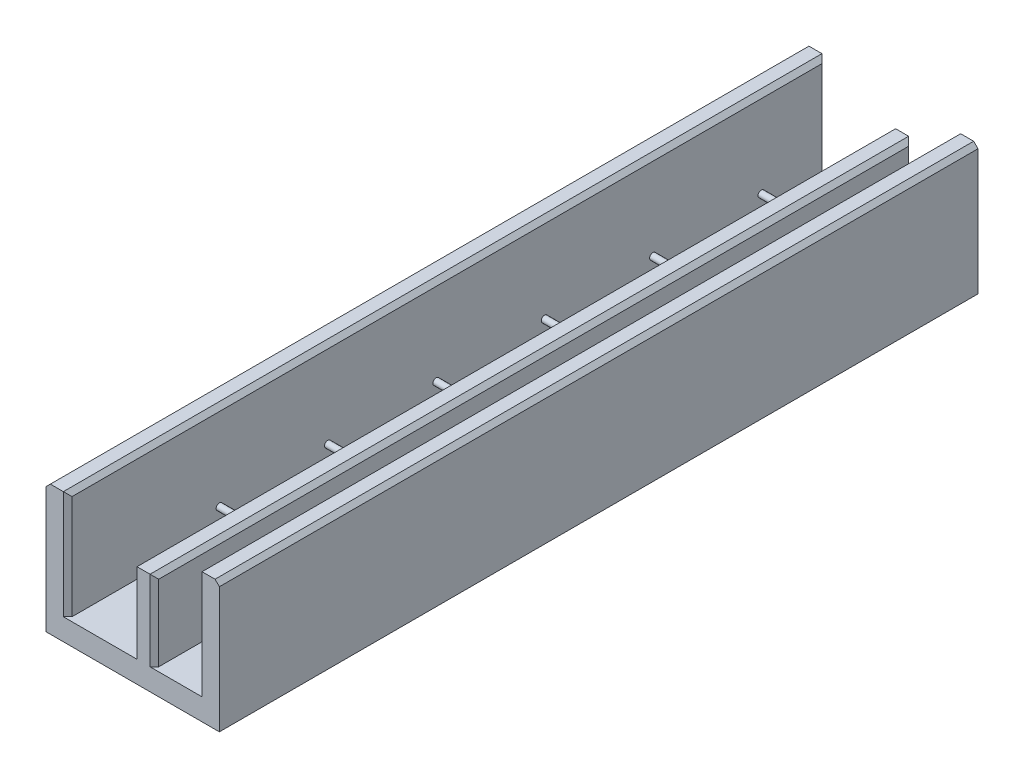
ISO-10303-21;
HEADER;
FILE_DESCRIPTION(('STEP AP214'),'2;1');
FILE_NAME('part.step','',(''),(''),'','','');
FILE_SCHEMA(('AUTOMOTIVE_DESIGN { 1 0 10303 214 1 1 1 1 }'));
ENDSEC;
DATA;
#1=APPLICATION_CONTEXT('core data for automotive mechanical design processes');
#2=APPLICATION_PROTOCOL_DEFINITION('international standard','automotive_design',2000,#1);
#3=PRODUCT_CONTEXT('',#1,'mechanical');
#4=PRODUCT('Part','Part','',(#3));
#5=PRODUCT_RELATED_PRODUCT_CATEGORY('part','',(#4));
#6=PRODUCT_DEFINITION_FORMATION('','',#4);
#7=PRODUCT_DEFINITION_CONTEXT('part definition',#1,'design');
#8=PRODUCT_DEFINITION('design','',#6,#7);
#9=PRODUCT_DEFINITION_SHAPE('','',#8);
#10=(LENGTH_UNIT() NAMED_UNIT(*) SI_UNIT(.MILLI.,.METRE.));
#11=(NAMED_UNIT(*) PLANE_ANGLE_UNIT() SI_UNIT($,.RADIAN.));
#12=(NAMED_UNIT(*) SI_UNIT($,.STERADIAN.) SOLID_ANGLE_UNIT());
#13=UNCERTAINTY_MEASURE_WITH_UNIT(LENGTH_MEASURE(1.E-05),#10,'distance_accuracy_value','');
#14=(GEOMETRIC_REPRESENTATION_CONTEXT(3) GLOBAL_UNCERTAINTY_ASSIGNED_CONTEXT((#13)) GLOBAL_UNIT_ASSIGNED_CONTEXT((#10,
#11,#12)) REPRESENTATION_CONTEXT('',''));
#15=CARTESIAN_POINT('',(0.,0.,0.));
#16=DIRECTION('',(0.,0.,1.));
#17=DIRECTION('',(1.,0.,0.));
#18=AXIS2_PLACEMENT_3D('',#15,#16,#17);
#19=CARTESIAN_POINT('',(0.,600.,3500.));
#20=DIRECTION('',(-1.,0.,0.));
#21=DIRECTION('',(0.,0.,1.));
#22=AXIS2_PLACEMENT_3D('',#19,#20,#21);
#23=PLANE('',#22);
#24=DIRECTION('',(0.,1.,0.));
#25=VECTOR('',#24,1.);
#26=CARTESIAN_POINT('',(0.,600.,0.));
#27=LINE('',#26,#25);
#28=CARTESIAN_POINT('',(0.,0.,0.));
#29=VERTEX_POINT('',#28);
#30=CARTESIAN_POINT('',(0.,580.,0.));
#31=VERTEX_POINT('',#30);
#32=EDGE_CURVE('E219',#29,#31,#27,.T.);
#33=ORIENTED_EDGE('',*,*,#32,.T.);
#34=DIRECTION('',(0.,0.,1.));
#35=VECTOR('',#34,1.);
#36=CARTESIAN_POINT('',(0.,580.,3500.));
#37=LINE('',#36,#35);
#38=CARTESIAN_POINT('',(0.,580.,3500.));
#39=VERTEX_POINT('',#38);
#40=EDGE_CURVE('E289',#31,#39,#37,.T.);
#41=ORIENTED_EDGE('',*,*,#40,.T.);
#42=DIRECTION('',(0.,1.,0.));
#43=VECTOR('',#42,1.);
#44=CARTESIAN_POINT('',(0.,600.,3500.));
#45=LINE('',#44,#43);
#46=CARTESIAN_POINT('',(0.,0.,3500.));
#47=VERTEX_POINT('',#46);
#48=EDGE_CURVE('E238',#47,#39,#45,.T.);
#49=ORIENTED_EDGE('',*,*,#48,.F.);
#50=DIRECTION('',(0.,0.,-1.));
#51=VECTOR('',#50,1.);
#52=CARTESIAN_POINT('',(0.,0.,3500.));
#53=LINE('',#52,#51);
#54=EDGE_CURVE('E210',#47,#29,#53,.T.);
#55=ORIENTED_EDGE('',*,*,#54,.T.);
#56=EDGE_LOOP('',(#33,#41,#49,#55));
#57=FACE_BOUND('',#56,.T.);
#58=ADVANCED_FACE('F37',(#57),#23,.F.);
#59=CARTESIAN_POINT('',(-100.,600.,3500.));
#60=DIRECTION('',(0.,-1.,0.));
#61=DIRECTION('',(0.,0.,-1.));
#62=AXIS2_PLACEMENT_3D('',#59,#60,#61);
#63=PLANE('',#62);
#64=DIRECTION('',(-1.,0.,0.));
#65=VECTOR('',#64,1.);
#66=CARTESIAN_POINT('',(-100.,600.,3500.));
#67=LINE('',#66,#65);
#68=CARTESIAN_POINT('',(-20.,600.,3500.));
#69=VERTEX_POINT('',#68);
#70=CARTESIAN_POINT('',(-80.0000000000002,600.,3500.));
#71=VERTEX_POINT('',#70);
#72=EDGE_CURVE('E369',#69,#71,#67,.T.);
#73=ORIENTED_EDGE('',*,*,#72,.F.);
#74=DIRECTION('',(0.,0.,-1.));
#75=VECTOR('',#74,1.);
#76=CARTESIAN_POINT('',(-20.,600.,3500.));
#77=LINE('',#76,#75);
#78=CARTESIAN_POINT('',(-20.,600.,0.));
#79=VERTEX_POINT('',#78);
#80=EDGE_CURVE('E286',#69,#79,#77,.T.);
#81=ORIENTED_EDGE('',*,*,#80,.T.);
#82=DIRECTION('',(-1.,0.,0.));
#83=VECTOR('',#82,1.);
#84=CARTESIAN_POINT('',(-100.,600.,0.));
#85=LINE('',#84,#83);
#86=CARTESIAN_POINT('',(-80.0000000000002,600.,0.));
#87=VERTEX_POINT('',#86);
#88=EDGE_CURVE('E222',#79,#87,#85,.T.);
#89=ORIENTED_EDGE('',*,*,#88,.T.);
#90=DIRECTION('',(0.,0.,1.));
#91=VECTOR('',#90,1.);
#92=CARTESIAN_POINT('',(-80.0000000000002,600.,3500.));
#93=LINE('',#92,#91);
#94=EDGE_CURVE('E284',#87,#71,#93,.T.);
#95=ORIENTED_EDGE('',*,*,#94,.T.);
#96=EDGE_LOOP('',(#73,#81,#89,#95));
#97=FACE_BOUND('',#96,.T.);
#98=ADVANCED_FACE('F398',(#97),#63,.F.);
#99=CARTESIAN_POINT('',(-100.,99.9999999999998,3500.));
#100=DIRECTION('',(1.,0.,0.));
#101=DIRECTION('',(0.,0.,-1.));
#102=AXIS2_PLACEMENT_3D('',#99,#100,#101);
#103=PLANE('',#102);
#104=CARTESIAN_POINT('',(-100.,200.,2800.));
#105=DIRECTION('',(1.,0.,0.));
#106=DIRECTION('',(0.,0.,-1.));
#107=AXIS2_PLACEMENT_3D('',#104,#105,#106);
#108=CIRCLE('',#107,15.);
#109=CARTESIAN_POINT('',(-100.,200.,2785.));
#110=VERTEX_POINT('',#109);
#111=EDGE_CURVE('E925',#110,#110,#108,.F.);
#112=ORIENTED_EDGE('',*,*,#111,.F.);
#113=EDGE_LOOP('',(#112));
#114=FACE_BOUND('',#113,.T.);
#115=CARTESIAN_POINT('',(-100.,200.,2300.));
#116=DIRECTION('',(1.,0.,0.));
#117=DIRECTION('',(0.,0.,-1.));
#118=AXIS2_PLACEMENT_3D('',#115,#116,#117);
#119=CIRCLE('',#118,15.);
#120=CARTESIAN_POINT('',(-100.,200.,2285.));
#121=VERTEX_POINT('',#120);
#122=EDGE_CURVE('E916',#121,#121,#119,.F.);
#123=ORIENTED_EDGE('',*,*,#122,.F.);
#124=EDGE_LOOP('',(#123));
#125=FACE_BOUND('',#124,.T.);
#126=CARTESIAN_POINT('',(-100.,200.,1800.));
#127=DIRECTION('',(1.,0.,0.));
#128=DIRECTION('',(0.,0.,-1.));
#129=AXIS2_PLACEMENT_3D('',#126,#127,#128);
#130=CIRCLE('',#129,15.);
#131=CARTESIAN_POINT('',(-100.,200.,1785.));
#132=VERTEX_POINT('',#131);
#133=EDGE_CURVE('E906',#132,#132,#130,.F.);
#134=ORIENTED_EDGE('',*,*,#133,.F.);
#135=EDGE_LOOP('',(#134));
#136=FACE_BOUND('',#135,.T.);
#137=CARTESIAN_POINT('',(-100.,200.,1300.));
#138=DIRECTION('',(1.,0.,0.));
#139=DIRECTION('',(0.,0.,-1.));
#140=AXIS2_PLACEMENT_3D('',#137,#138,#139);
#141=CIRCLE('',#140,15.);
#142=CARTESIAN_POINT('',(-100.,200.,1285.));
#143=VERTEX_POINT('',#142);
#144=EDGE_CURVE('E896',#143,#143,#141,.F.);
#145=ORIENTED_EDGE('',*,*,#144,.F.);
#146=EDGE_LOOP('',(#145));
#147=FACE_BOUND('',#146,.T.);
#148=CARTESIAN_POINT('',(-100.,200.,800.));
#149=DIRECTION('',(1.,0.,0.));
#150=DIRECTION('',(0.,0.,-1.));
#151=AXIS2_PLACEMENT_3D('',#148,#149,#150);
#152=CIRCLE('',#151,15.);
#153=CARTESIAN_POINT('',(-100.,200.,785.));
#154=VERTEX_POINT('',#153);
#155=EDGE_CURVE('E885',#154,#154,#152,.F.);
#156=ORIENTED_EDGE('',*,*,#155,.F.);
#157=EDGE_LOOP('',(#156));
#158=FACE_BOUND('',#157,.T.);
#159=CARTESIAN_POINT('',(-100.,200.,300.));
#160=DIRECTION('',(1.,0.,0.));
#161=DIRECTION('',(0.,0.,-1.));
#162=AXIS2_PLACEMENT_3D('',#159,#160,#161);
#163=CIRCLE('',#162,15.);
#164=CARTESIAN_POINT('',(-100.,200.,285.));
#165=VERTEX_POINT('',#164);
#166=EDGE_CURVE('E556',#165,#165,#163,.F.);
#167=ORIENTED_EDGE('',*,*,#166,.F.);
#168=EDGE_LOOP('',(#167));
#169=FACE_BOUND('',#168,.T.);
#170=DIRECTION('',(0.,0.,-1.));
#171=VECTOR('',#170,1.);
#172=CARTESIAN_POINT('',(-100.,580.,3500.));
#173=LINE('',#172,#171);
#174=CARTESIAN_POINT('',(-100.,580.,3480.));
#175=VERTEX_POINT('',#174);
#176=CARTESIAN_POINT('',(-100.,580.,20.));
#177=VERTEX_POINT('',#176);
#178=EDGE_CURVE('E300',#175,#177,#173,.T.);
#179=ORIENTED_EDGE('',*,*,#178,.T.);
#180=DIRECTION('',(0.,-1.,0.));
#181=VECTOR('',#180,1.);
#182=CARTESIAN_POINT('',(-100.,99.9999999999998,20.));
#183=LINE('',#182,#181);
#184=CARTESIAN_POINT('',(-100.,99.9999999999998,20.));
#185=VERTEX_POINT('',#184);
#186=EDGE_CURVE('E302',#177,#185,#183,.T.);
#187=ORIENTED_EDGE('',*,*,#186,.T.);
#188=DIRECTION('',(0.,0.,-1.));
#189=VECTOR('',#188,1.);
#190=CARTESIAN_POINT('',(-100.,99.9999999999998,3500.));
#191=LINE('',#190,#189);
#192=CARTESIAN_POINT('',(-100.,99.9999999999998,3480.));
#193=VERTEX_POINT('',#192);
#194=EDGE_CURVE('E248',#193,#185,#191,.T.);
#195=ORIENTED_EDGE('',*,*,#194,.F.);
#196=DIRECTION('',(0.,1.,0.));
#197=VECTOR('',#196,1.);
#198=CARTESIAN_POINT('',(-100.,99.9999999999998,3480.));
#199=LINE('',#198,#197);
#200=EDGE_CURVE('E298',#193,#175,#199,.T.);
#201=ORIENTED_EDGE('',*,*,#200,.T.);
#202=EDGE_LOOP('',(#179,#187,#195,#201));
#203=FACE_BOUND('',#202,.T.);
#204=ADVANCED_FACE('F418',(#114,#125,#136,#147,#158,#169,#203),#103,.F.);
#205=CARTESIAN_POINT('',(-300.,99.9999999999998,3500.));
#206=DIRECTION('',(0.,-1.,0.));
#207=DIRECTION('',(0.,0.,-1.));
#208=AXIS2_PLACEMENT_3D('',#205,#206,#207);
#209=PLANE('',#208);
#210=DIRECTION('',(-1.,0.,0.));
#211=VECTOR('',#210,1.);
#212=CARTESIAN_POINT('',(-300.,99.9999999999998,0.));
#213=LINE('',#212,#211);
#214=CARTESIAN_POINT('',(-80.0000000000002,99.9999999999998,0.));
#215=VERTEX_POINT('',#214);
#216=CARTESIAN_POINT('',(-320.,99.9999999999998,0.));
#217=VERTEX_POINT('',#216);
#218=EDGE_CURVE('E226',#215,#217,#213,.T.);
#219=ORIENTED_EDGE('',*,*,#218,.T.);
#220=DIRECTION('',(0.70710678118654,0.,0.707106781186555));
#221=VECTOR('',#220,1.);
#222=CARTESIAN_POINT('',(1440.,99.9999999999998,1760.00000000004));
#223=LINE('',#222,#221);
#224=CARTESIAN_POINT('',(-300.,99.9999999999998,20.0000000000005));
#225=VERTEX_POINT('',#224);
#226=EDGE_CURVE('E330',#217,#225,#223,.T.);
#227=ORIENTED_EDGE('',*,*,#226,.T.);
#228=DIRECTION('',(0.,0.,-1.));
#229=VECTOR('',#228,1.);
#230=CARTESIAN_POINT('',(-300.,99.9999999999998,3500.));
#231=LINE('',#230,#229);
#232=CARTESIAN_POINT('',(-300.,99.9999999999998,3480.));
#233=VERTEX_POINT('',#232);
#234=EDGE_CURVE('E245',#233,#225,#231,.T.);
#235=ORIENTED_EDGE('',*,*,#234,.F.);
#236=DIRECTION('',(0.70710678118654,0.,-0.707106781186555));
#237=VECTOR('',#236,1.);
#238=CARTESIAN_POINT('',(-310.,99.9999999999998,3490.));
#239=LINE('',#238,#237);
#240=CARTESIAN_POINT('',(-320.,99.9999999999998,3500.));
#241=VERTEX_POINT('',#240);
#242=EDGE_CURVE('E332',#233,#241,#239,.F.);
#243=ORIENTED_EDGE('',*,*,#242,.T.);
#244=DIRECTION('',(-1.,0.,0.));
#245=VECTOR('',#244,1.);
#246=CARTESIAN_POINT('',(-300.,99.9999999999998,3500.));
#247=LINE('',#246,#245);
#248=CARTESIAN_POINT('',(-80.0000000000002,99.9999999999998,3500.));
#249=VERTEX_POINT('',#248);
#250=EDGE_CURVE('E372',#249,#241,#247,.T.);
#251=ORIENTED_EDGE('',*,*,#250,.F.);
#252=DIRECTION('',(0.707106781186548,0.,0.707106781186548));
#253=VECTOR('',#252,1.);
#254=CARTESIAN_POINT('',(-190.,99.9999999999998,3390.));
#255=LINE('',#254,#253);
#256=EDGE_CURVE('E328',#249,#193,#255,.F.);
#257=ORIENTED_EDGE('',*,*,#256,.T.);
#258=ORIENTED_EDGE('',*,*,#194,.T.);
#259=DIRECTION('',(0.707106781186548,0.,-0.707106781186548));
#260=VECTOR('',#259,1.);
#261=CARTESIAN_POINT('',(-1940.,99.9999999999998,1860.));
#262=LINE('',#261,#260);
#263=EDGE_CURVE('E325',#185,#215,#262,.T.);
#264=ORIENTED_EDGE('',*,*,#263,.T.);
#265=EDGE_LOOP('',(#219,#227,#235,#243,#251,#257,#258,#264));
#266=FACE_BOUND('',#265,.T.);
#267=ADVANCED_FACE('F416',(#266),#209,.F.);
#268=CARTESIAN_POINT('',(-300.,470.,3500.));
#269=DIRECTION('',(-1.,0.,0.));
#270=DIRECTION('',(0.,-1.,0.));
#271=AXIS2_PLACEMENT_3D('',#268,#269,#270);
#272=PLANE('',#271);
#273=CARTESIAN_POINT('',(-300.,200.,2800.));
#274=DIRECTION('',(-1.,0.,0.));
#275=DIRECTION('',(0.,-1.,0.));
#276=AXIS2_PLACEMENT_3D('',#273,#274,#275);
#277=CIRCLE('',#276,15.);
#278=CARTESIAN_POINT('',(-300.,185.,2800.));
#279=VERTEX_POINT('',#278);
#280=EDGE_CURVE('E537',#279,#279,#277,.T.);
#281=ORIENTED_EDGE('',*,*,#280,.T.);
#282=EDGE_LOOP('',(#281));
#283=FACE_BOUND('',#282,.T.);
#284=CARTESIAN_POINT('',(-300.,200.,2300.));
#285=DIRECTION('',(-1.,0.,0.));
#286=DIRECTION('',(0.,-1.,0.));
#287=AXIS2_PLACEMENT_3D('',#284,#285,#286);
#288=CIRCLE('',#287,15.);
#289=CARTESIAN_POINT('',(-300.,185.,2300.));
#290=VERTEX_POINT('',#289);
#291=EDGE_CURVE('E541',#290,#290,#288,.T.);
#292=ORIENTED_EDGE('',*,*,#291,.T.);
#293=EDGE_LOOP('',(#292));
#294=FACE_BOUND('',#293,.T.);
#295=CARTESIAN_POINT('',(-300.,200.,1800.));
#296=DIRECTION('',(-1.,0.,0.));
#297=DIRECTION('',(0.,-1.,0.));
#298=AXIS2_PLACEMENT_3D('',#295,#296,#297);
#299=CIRCLE('',#298,15.);
#300=CARTESIAN_POINT('',(-300.,185.,1800.));
#301=VERTEX_POINT('',#300);
#302=EDGE_CURVE('E545',#301,#301,#299,.T.);
#303=ORIENTED_EDGE('',*,*,#302,.T.);
#304=EDGE_LOOP('',(#303));
#305=FACE_BOUND('',#304,.T.);
#306=CARTESIAN_POINT('',(-300.,200.,1300.));
#307=DIRECTION('',(-1.,0.,0.));
#308=DIRECTION('',(0.,-1.,0.));
#309=AXIS2_PLACEMENT_3D('',#306,#307,#308);
#310=CIRCLE('',#309,15.);
#311=CARTESIAN_POINT('',(-300.,185.,1300.));
#312=VERTEX_POINT('',#311);
#313=EDGE_CURVE('E549',#312,#312,#310,.T.);
#314=ORIENTED_EDGE('',*,*,#313,.T.);
#315=EDGE_LOOP('',(#314));
#316=FACE_BOUND('',#315,.T.);
#317=CARTESIAN_POINT('',(-300.,200.,800.));
#318=DIRECTION('',(-1.,0.,0.));
#319=DIRECTION('',(0.,-1.,0.));
#320=AXIS2_PLACEMENT_3D('',#317,#318,#319);
#321=CIRCLE('',#320,15.);
#322=CARTESIAN_POINT('',(-300.,185.,800.));
#323=VERTEX_POINT('',#322);
#324=EDGE_CURVE('E552',#323,#323,#321,.T.);
#325=ORIENTED_EDGE('',*,*,#324,.T.);
#326=EDGE_LOOP('',(#325));
#327=FACE_BOUND('',#326,.T.);
#328=CARTESIAN_POINT('',(-300.,200.,300.));
#329=DIRECTION('',(-1.,0.,0.));
#330=DIRECTION('',(0.,-1.,0.));
#331=AXIS2_PLACEMENT_3D('',#328,#329,#330);
#332=CIRCLE('',#331,15.);
#333=CARTESIAN_POINT('',(-300.,185.,300.));
#334=VERTEX_POINT('',#333);
#335=EDGE_CURVE('E353',#334,#334,#332,.T.);
#336=ORIENTED_EDGE('',*,*,#335,.T.);
#337=EDGE_LOOP('',(#336));
#338=FACE_BOUND('',#337,.T.);
#339=ORIENTED_EDGE('',*,*,#234,.T.);
#340=DIRECTION('',(0.,1.,0.));
#341=VECTOR('',#340,1.);
#342=CARTESIAN_POINT('',(-300.,470.,20.0000000000005));
#343=LINE('',#342,#341);
#344=CARTESIAN_POINT('',(-300.,449.999999999999,20.0000000000005));
#345=VERTEX_POINT('',#344);
#346=EDGE_CURVE('E309',#225,#345,#343,.T.);
#347=ORIENTED_EDGE('',*,*,#346,.T.);
#348=DIRECTION('',(0.,0.,1.));
#349=VECTOR('',#348,1.);
#350=CARTESIAN_POINT('',(-300.,449.999999999999,3500.));
#351=LINE('',#350,#349);
#352=CARTESIAN_POINT('',(-300.,449.999999999999,3480.));
#353=VERTEX_POINT('',#352);
#354=EDGE_CURVE('E305',#345,#353,#351,.T.);
#355=ORIENTED_EDGE('',*,*,#354,.T.);
#356=DIRECTION('',(0.,-1.,0.));
#357=VECTOR('',#356,1.);
#358=CARTESIAN_POINT('',(-300.,470.,3480.));
#359=LINE('',#358,#357);
#360=EDGE_CURVE('E307',#353,#233,#359,.T.);
#361=ORIENTED_EDGE('',*,*,#360,.T.);
#362=EDGE_LOOP('',(#339,#347,#355,#361));
#363=FACE_BOUND('',#362,.T.);
#364=ADVANCED_FACE('F426',(#283,#294,#305,#316,#327,#338,#363),#272,.F.);
#365=CARTESIAN_POINT('',(-400.,470.,3500.));
#366=DIRECTION('',(0.,-1.,0.));
#367=DIRECTION('',(1.,0.,0.));
#368=AXIS2_PLACEMENT_3D('',#365,#366,#367);
#369=PLANE('',#368);
#370=DIRECTION('',(-1.,0.,0.));
#371=VECTOR('',#370,1.);
#372=CARTESIAN_POINT('',(-400.,470.,3500.));
#373=LINE('',#372,#371);
#374=CARTESIAN_POINT('',(-320.,470.,3500.));
#375=VERTEX_POINT('',#374);
#376=CARTESIAN_POINT('',(-380.,470.,3500.));
#377=VERTEX_POINT('',#376);
#378=EDGE_CURVE('E374',#375,#377,#373,.T.);
#379=ORIENTED_EDGE('',*,*,#378,.F.);
#380=DIRECTION('',(0.,0.,-1.));
#381=VECTOR('',#380,1.);
#382=CARTESIAN_POINT('',(-320.,470.,3500.));
#383=LINE('',#382,#381);
#384=CARTESIAN_POINT('',(-320.,470.,0.));
#385=VERTEX_POINT('',#384);
#386=EDGE_CURVE('E314',#375,#385,#383,.T.);
#387=ORIENTED_EDGE('',*,*,#386,.T.);
#388=DIRECTION('',(-1.,0.,0.));
#389=VECTOR('',#388,1.);
#390=CARTESIAN_POINT('',(-400.,470.,0.));
#391=LINE('',#390,#389);
#392=CARTESIAN_POINT('',(-380.,470.,0.));
#393=VERTEX_POINT('',#392);
#394=EDGE_CURVE('E228',#385,#393,#391,.T.);
#395=ORIENTED_EDGE('',*,*,#394,.T.);
#396=DIRECTION('',(0.,0.,1.));
#397=VECTOR('',#396,1.);
#398=CARTESIAN_POINT('',(-380.,470.,3500.));
#399=LINE('',#398,#397);
#400=EDGE_CURVE('E312',#393,#377,#399,.T.);
#401=ORIENTED_EDGE('',*,*,#400,.T.);
#402=EDGE_LOOP('',(#379,#387,#395,#401));
#403=FACE_BOUND('',#402,.T.);
#404=ADVANCED_FACE('F487',(#403),#369,.F.);
#405=CARTESIAN_POINT('',(-400.,99.9999999999999,3500.));
#406=DIRECTION('',(1.,0.,0.));
#407=DIRECTION('',(0.,0.,-1.));
#408=AXIS2_PLACEMENT_3D('',#405,#406,#407);
#409=PLANE('',#408);
#410=CARTESIAN_POINT('',(-400.,200.,2800.));
#411=DIRECTION('',(1.,0.,0.));
#412=DIRECTION('',(0.,0.,-1.));
#413=AXIS2_PLACEMENT_3D('',#410,#411,#412);
#414=CIRCLE('',#413,15.);
#415=CARTESIAN_POINT('',(-400.,200.,2785.));
#416=VERTEX_POINT('',#415);
#417=EDGE_CURVE('E920',#416,#416,#414,.T.);
#418=ORIENTED_EDGE('',*,*,#417,.T.);
#419=EDGE_LOOP('',(#418));
#420=FACE_BOUND('',#419,.T.);
#421=CARTESIAN_POINT('',(-400.,200.,2300.));
#422=DIRECTION('',(1.,0.,0.));
#423=DIRECTION('',(0.,0.,-1.));
#424=AXIS2_PLACEMENT_3D('',#421,#422,#423);
#425=CIRCLE('',#424,15.);
#426=CARTESIAN_POINT('',(-400.,200.,2285.));
#427=VERTEX_POINT('',#426);
#428=EDGE_CURVE('E910',#427,#427,#425,.T.);
#429=ORIENTED_EDGE('',*,*,#428,.T.);
#430=EDGE_LOOP('',(#429));
#431=FACE_BOUND('',#430,.T.);
#432=CARTESIAN_POINT('',(-400.,200.,1800.));
#433=DIRECTION('',(1.,0.,0.));
#434=DIRECTION('',(0.,0.,-1.));
#435=AXIS2_PLACEMENT_3D('',#432,#433,#434);
#436=CIRCLE('',#435,15.);
#437=CARTESIAN_POINT('',(-400.,200.,1785.));
#438=VERTEX_POINT('',#437);
#439=EDGE_CURVE('E900',#438,#438,#436,.T.);
#440=ORIENTED_EDGE('',*,*,#439,.T.);
#441=EDGE_LOOP('',(#440));
#442=FACE_BOUND('',#441,.T.);
#443=CARTESIAN_POINT('',(-400.,200.,1300.));
#444=DIRECTION('',(1.,0.,0.));
#445=DIRECTION('',(0.,0.,-1.));
#446=AXIS2_PLACEMENT_3D('',#443,#444,#445);
#447=CIRCLE('',#446,15.);
#448=CARTESIAN_POINT('',(-400.,200.,1285.));
#449=VERTEX_POINT('',#448);
#450=EDGE_CURVE('E890',#449,#449,#447,.T.);
#451=ORIENTED_EDGE('',*,*,#450,.T.);
#452=EDGE_LOOP('',(#451));
#453=FACE_BOUND('',#452,.T.);
#454=CARTESIAN_POINT('',(-400.,200.,800.));
#455=DIRECTION('',(1.,0.,0.));
#456=DIRECTION('',(0.,0.,-1.));
#457=AXIS2_PLACEMENT_3D('',#454,#455,#456);
#458=CIRCLE('',#457,15.);
#459=CARTESIAN_POINT('',(-400.,200.,785.));
#460=VERTEX_POINT('',#459);
#461=EDGE_CURVE('E557',#460,#460,#458,.T.);
#462=ORIENTED_EDGE('',*,*,#461,.T.);
#463=EDGE_LOOP('',(#462));
#464=FACE_BOUND('',#463,.T.);
#465=CARTESIAN_POINT('',(-400.,200.,300.));
#466=DIRECTION('',(1.,0.,0.));
#467=DIRECTION('',(0.,0.,-1.));
#468=AXIS2_PLACEMENT_3D('',#465,#466,#467);
#469=CIRCLE('',#468,15.);
#470=CARTESIAN_POINT('',(-400.,200.,285.));
#471=VERTEX_POINT('',#470);
#472=EDGE_CURVE('E359',#471,#471,#469,.T.);
#473=ORIENTED_EDGE('',*,*,#472,.T.);
#474=EDGE_LOOP('',(#473));
#475=FACE_BOUND('',#474,.T.);
#476=DIRECTION('',(0.,0.,-1.));
#477=VECTOR('',#476,1.);
#478=CARTESIAN_POINT('',(-400.,450.,3500.));
#479=LINE('',#478,#477);
#480=CARTESIAN_POINT('',(-400.,450.,3480.));
#481=VERTEX_POINT('',#480);
#482=CARTESIAN_POINT('',(-400.,450.,19.9999999999996));
#483=VERTEX_POINT('',#482);
#484=EDGE_CURVE('E54',#481,#483,#479,.T.);
#485=ORIENTED_EDGE('',*,*,#484,.T.);
#486=DIRECTION('',(0.,-1.,0.));
#487=VECTOR('',#486,1.);
#488=CARTESIAN_POINT('',(-400.,99.9999999999999,19.9999999999996));
#489=LINE('',#488,#487);
#490=CARTESIAN_POINT('',(-400.,99.9999999999999,19.9999999999996));
#491=VERTEX_POINT('',#490);
#492=EDGE_CURVE('E318',#483,#491,#489,.T.);
#493=ORIENTED_EDGE('',*,*,#492,.T.);
#494=DIRECTION('',(0.,0.,-1.));
#495=VECTOR('',#494,1.);
#496=CARTESIAN_POINT('',(-400.,99.9999999999999,3500.));
#497=LINE('',#496,#495);
#498=CARTESIAN_POINT('',(-400.,99.9999999999999,3480.));
#499=VERTEX_POINT('',#498);
#500=EDGE_CURVE('E242',#499,#491,#497,.T.);
#501=ORIENTED_EDGE('',*,*,#500,.F.);
#502=DIRECTION('',(0.,1.,0.));
#503=VECTOR('',#502,1.);
#504=CARTESIAN_POINT('',(-400.,99.9999999999999,3480.));
#505=LINE('',#504,#503);
#506=EDGE_CURVE('E59',#499,#481,#505,.T.);
#507=ORIENTED_EDGE('',*,*,#506,.T.);
#508=EDGE_LOOP('',(#485,#493,#501,#507));
#509=FACE_BOUND('',#508,.T.);
#510=ADVANCED_FACE('F498',(#420,#431,#442,#453,#464,#475,#509),#409,.F.);
#511=CARTESIAN_POINT('',(-700.,99.9999999999999,3500.));
#512=DIRECTION('',(0.,-1.,0.));
#513=DIRECTION('',(1.,0.,0.));
#514=AXIS2_PLACEMENT_3D('',#511,#512,#513);
#515=PLANE('',#514);
#516=DIRECTION('',(-1.,0.,0.));
#517=VECTOR('',#516,1.);
#518=CARTESIAN_POINT('',(-700.,99.9999999999999,0.));
#519=LINE('',#518,#517);
#520=CARTESIAN_POINT('',(-380.,99.9999999999999,0.));
#521=VERTEX_POINT('',#520);
#522=CARTESIAN_POINT('',(-720.,99.9999999999999,0.));
#523=VERTEX_POINT('',#522);
#524=EDGE_CURVE('E231',#521,#523,#519,.T.);
#525=ORIENTED_EDGE('',*,*,#524,.T.);
#526=DIRECTION('',(0.707106781186549,0.,0.707106781186546));
#527=VECTOR('',#526,1.);
#528=CARTESIAN_POINT('',(1040.,99.9999999999999,1759.99999999999));
#529=LINE('',#528,#527);
#530=CARTESIAN_POINT('',(-700.,99.9999999999999,20.));
#531=VERTEX_POINT('',#530);
#532=EDGE_CURVE('E320',#523,#531,#529,.T.);
#533=ORIENTED_EDGE('',*,*,#532,.T.);
#534=DIRECTION('',(0.,0.,-1.));
#535=VECTOR('',#534,1.);
#536=CARTESIAN_POINT('',(-700.,99.9999999999999,3500.));
#537=LINE('',#536,#535);
#538=CARTESIAN_POINT('',(-700.,99.9999999999999,3480.));
#539=VERTEX_POINT('',#538);
#540=EDGE_CURVE('E209',#539,#531,#537,.T.);
#541=ORIENTED_EDGE('',*,*,#540,.F.);
#542=DIRECTION('',(0.707106781186549,0.,-0.707106781186546));
#543=VECTOR('',#542,1.);
#544=CARTESIAN_POINT('',(-710.,99.9999999999999,3490.));
#545=LINE('',#544,#543);
#546=CARTESIAN_POINT('',(-720.,99.9999999999999,3500.));
#547=VERTEX_POINT('',#546);
#548=EDGE_CURVE('E322',#539,#547,#545,.F.);
#549=ORIENTED_EDGE('',*,*,#548,.T.);
#550=DIRECTION('',(-1.,0.,0.));
#551=VECTOR('',#550,1.);
#552=CARTESIAN_POINT('',(-700.,99.9999999999999,3500.));
#553=LINE('',#552,#551);
#554=CARTESIAN_POINT('',(-380.,99.9999999999999,3500.));
#555=VERTEX_POINT('',#554);
#556=EDGE_CURVE('E377',#555,#547,#553,.T.);
#557=ORIENTED_EDGE('',*,*,#556,.F.);
#558=DIRECTION('',(0.707106781186555,0.,0.70710678118654));
#559=VECTOR('',#558,1.);
#560=CARTESIAN_POINT('',(-540.000000000004,99.9999999999999,3340.));
#561=LINE('',#560,#559);
#562=EDGE_CURVE('E11',#555,#499,#561,.F.);
#563=ORIENTED_EDGE('',*,*,#562,.T.);
#564=ORIENTED_EDGE('',*,*,#500,.T.);
#565=DIRECTION('',(0.707106781186555,0.,-0.70710678118654));
#566=VECTOR('',#565,1.);
#567=CARTESIAN_POINT('',(-2290.,99.9999999999998,1909.99999999996));
#568=LINE('',#567,#566);
#569=EDGE_CURVE('E46',#491,#521,#568,.T.);
#570=ORIENTED_EDGE('',*,*,#569,.T.);
#571=EDGE_LOOP('',(#525,#533,#541,#549,#557,#563,#564,#570));
#572=FACE_BOUND('',#571,.T.);
#573=ADVANCED_FACE('F499',(#572),#515,.F.);
#574=CARTESIAN_POINT('',(-700.,600.,3500.));
#575=DIRECTION('',(-1.,0.,0.));
#576=DIRECTION('',(0.,-1.,0.));
#577=AXIS2_PLACEMENT_3D('',#574,#575,#576);
#578=PLANE('',#577);
#579=CARTESIAN_POINT('',(-700.,200.,2800.));
#580=DIRECTION('',(-1.,0.,0.));
#581=DIRECTION('',(0.,-1.,0.));
#582=AXIS2_PLACEMENT_3D('',#579,#580,#581);
#583=CIRCLE('',#582,15.);
#584=CARTESIAN_POINT('',(-700.,185.,2800.));
#585=VERTEX_POINT('',#584);
#586=EDGE_CURVE('E923',#585,#585,#583,.T.);
#587=ORIENTED_EDGE('',*,*,#586,.T.);
#588=EDGE_LOOP('',(#587));
#589=FACE_BOUND('',#588,.T.);
#590=CARTESIAN_POINT('',(-700.,200.,2300.));
#591=DIRECTION('',(-1.,0.,0.));
#592=DIRECTION('',(0.,-1.,0.));
#593=AXIS2_PLACEMENT_3D('',#590,#591,#592);
#594=CIRCLE('',#593,15.);
#595=CARTESIAN_POINT('',(-700.,185.,2300.));
#596=VERTEX_POINT('',#595);
#597=EDGE_CURVE('E913',#596,#596,#594,.T.);
#598=ORIENTED_EDGE('',*,*,#597,.T.);
#599=EDGE_LOOP('',(#598));
#600=FACE_BOUND('',#599,.T.);
#601=CARTESIAN_POINT('',(-700.,200.,1800.));
#602=DIRECTION('',(-1.,0.,0.));
#603=DIRECTION('',(0.,-1.,0.));
#604=AXIS2_PLACEMENT_3D('',#601,#602,#603);
#605=CIRCLE('',#604,15.);
#606=CARTESIAN_POINT('',(-700.,185.,1800.));
#607=VERTEX_POINT('',#606);
#608=EDGE_CURVE('E903',#607,#607,#605,.T.);
#609=ORIENTED_EDGE('',*,*,#608,.T.);
#610=EDGE_LOOP('',(#609));
#611=FACE_BOUND('',#610,.T.);
#612=CARTESIAN_POINT('',(-700.,200.,1300.));
#613=DIRECTION('',(-1.,0.,0.));
#614=DIRECTION('',(0.,-1.,0.));
#615=AXIS2_PLACEMENT_3D('',#612,#613,#614);
#616=CIRCLE('',#615,15.);
#617=CARTESIAN_POINT('',(-700.,185.,1300.));
#618=VERTEX_POINT('',#617);
#619=EDGE_CURVE('E893',#618,#618,#616,.T.);
#620=ORIENTED_EDGE('',*,*,#619,.T.);
#621=EDGE_LOOP('',(#620));
#622=FACE_BOUND('',#621,.T.);
#623=CARTESIAN_POINT('',(-700.,200.,800.));
#624=DIRECTION('',(-1.,0.,0.));
#625=DIRECTION('',(0.,-1.,0.));
#626=AXIS2_PLACEMENT_3D('',#623,#624,#625);
#627=CIRCLE('',#626,15.);
#628=CARTESIAN_POINT('',(-700.,185.,800.));
#629=VERTEX_POINT('',#628);
#630=EDGE_CURVE('E562',#629,#629,#627,.T.);
#631=ORIENTED_EDGE('',*,*,#630,.T.);
#632=EDGE_LOOP('',(#631));
#633=FACE_BOUND('',#632,.T.);
#634=CARTESIAN_POINT('',(-700.,200.,300.));
#635=DIRECTION('',(-1.,0.,0.));
#636=DIRECTION('',(0.,-1.,0.));
#637=AXIS2_PLACEMENT_3D('',#634,#635,#636);
#638=CIRCLE('',#637,15.);
#639=CARTESIAN_POINT('',(-700.,185.,300.));
#640=VERTEX_POINT('',#639);
#641=EDGE_CURVE('E364',#640,#640,#638,.T.);
#642=ORIENTED_EDGE('',*,*,#641,.T.);
#643=EDGE_LOOP('',(#642));
#644=FACE_BOUND('',#643,.T.);
#645=ORIENTED_EDGE('',*,*,#540,.T.);
#646=DIRECTION('',(0.,1.,0.));
#647=VECTOR('',#646,1.);
#648=CARTESIAN_POINT('',(-700.,600.,20.));
#649=LINE('',#648,#647);
#650=CARTESIAN_POINT('',(-700.,580.,20.));
#651=VERTEX_POINT('',#650);
#652=EDGE_CURVE('E295',#531,#651,#649,.T.);
#653=ORIENTED_EDGE('',*,*,#652,.T.);
#654=DIRECTION('',(0.,0.,1.));
#655=VECTOR('',#654,1.);
#656=CARTESIAN_POINT('',(-700.,580.,3500.));
#657=LINE('',#656,#655);
#658=CARTESIAN_POINT('',(-700.,580.,3480.));
#659=VERTEX_POINT('',#658);
#660=EDGE_CURVE('E293',#651,#659,#657,.T.);
#661=ORIENTED_EDGE('',*,*,#660,.T.);
#662=DIRECTION('',(0.,-1.,0.));
#663=VECTOR('',#662,1.);
#664=CARTESIAN_POINT('',(-700.,600.,3480.));
#665=LINE('',#664,#663);
#666=EDGE_CURVE('E291',#659,#539,#665,.T.);
#667=ORIENTED_EDGE('',*,*,#666,.T.);
#668=EDGE_LOOP('',(#645,#653,#661,#667));
#669=FACE_BOUND('',#668,.T.);
#670=ADVANCED_FACE('F511',(#589,#600,#611,#622,#633,#644,#669),#578,.F.);
#671=CARTESIAN_POINT('',(-800.,600.,3500.));
#672=DIRECTION('',(0.,-1.,0.));
#673=DIRECTION('',(0.,0.,-1.));
#674=AXIS2_PLACEMENT_3D('',#671,#672,#673);
#675=PLANE('',#674);
#676=DIRECTION('',(-1.,0.,0.));
#677=VECTOR('',#676,1.);
#678=CARTESIAN_POINT('',(-800.,600.,0.));
#679=LINE('',#678,#677);
#680=CARTESIAN_POINT('',(-720.,600.,0.));
#681=VERTEX_POINT('',#680);
#682=CARTESIAN_POINT('',(-780.,600.,0.));
#683=VERTEX_POINT('',#682);
#684=EDGE_CURVE('E233',#681,#683,#679,.T.);
#685=ORIENTED_EDGE('',*,*,#684,.T.);
#686=DIRECTION('',(0.,0.,1.));
#687=VECTOR('',#686,1.);
#688=CARTESIAN_POINT('',(-780.,600.,3500.));
#689=LINE('',#688,#687);
#690=CARTESIAN_POINT('',(-780.,600.,3500.));
#691=VERTEX_POINT('',#690);
#692=EDGE_CURVE('E269',#683,#691,#689,.T.);
#693=ORIENTED_EDGE('',*,*,#692,.T.);
#694=DIRECTION('',(-1.,0.,0.));
#695=VECTOR('',#694,1.);
#696=CARTESIAN_POINT('',(-800.,600.,3500.));
#697=LINE('',#696,#695);
#698=CARTESIAN_POINT('',(-720.,600.,3500.));
#699=VERTEX_POINT('',#698);
#700=EDGE_CURVE('E200',#699,#691,#697,.T.);
#701=ORIENTED_EDGE('',*,*,#700,.F.);
#702=DIRECTION('',(0.,0.,-1.));
#703=VECTOR('',#702,1.);
#704=CARTESIAN_POINT('',(-720.,600.,3500.));
#705=LINE('',#704,#703);
#706=EDGE_CURVE('E267',#699,#681,#705,.T.);
#707=ORIENTED_EDGE('',*,*,#706,.T.);
#708=EDGE_LOOP('',(#685,#693,#701,#707));
#709=FACE_BOUND('',#708,.T.);
#710=ADVANCED_FACE('F506',(#709),#675,.F.);
#711=CARTESIAN_POINT('',(-800.,0.,3500.));
#712=DIRECTION('',(1.,0.,0.));
#713=DIRECTION('',(0.,0.,-1.));
#714=AXIS2_PLACEMENT_3D('',#711,#712,#713);
#715=PLANE('',#714);
#716=DIRECTION('',(0.,-1.,0.));
#717=VECTOR('',#716,1.);
#718=CARTESIAN_POINT('',(-800.,0.,3500.));
#719=LINE('',#718,#717);
#720=CARTESIAN_POINT('',(-800.,580.,3500.));
#721=VERTEX_POINT('',#720);
#722=CARTESIAN_POINT('',(-800.,0.,3500.));
#723=VERTEX_POINT('',#722);
#724=EDGE_CURVE('E187',#721,#723,#719,.T.);
#725=ORIENTED_EDGE('',*,*,#724,.F.);
#726=DIRECTION('',(0.,0.,-1.));
#727=VECTOR('',#726,1.);
#728=CARTESIAN_POINT('',(-800.,580.,3500.));
#729=LINE('',#728,#727);
#730=CARTESIAN_POINT('',(-800.,580.,0.));
#731=VERTEX_POINT('',#730);
#732=EDGE_CURVE('E251',#721,#731,#729,.T.);
#733=ORIENTED_EDGE('',*,*,#732,.T.);
#734=DIRECTION('',(0.,-1.,0.));
#735=VECTOR('',#734,1.);
#736=CARTESIAN_POINT('',(-800.,0.,0.));
#737=LINE('',#736,#735);
#738=CARTESIAN_POINT('',(-800.,0.,0.));
#739=VERTEX_POINT('',#738);
#740=EDGE_CURVE('E206',#731,#739,#737,.T.);
#741=ORIENTED_EDGE('',*,*,#740,.T.);
#742=DIRECTION('',(0.,0.,-1.));
#743=VECTOR('',#742,1.);
#744=CARTESIAN_POINT('',(-800.,0.,3500.));
#745=LINE('',#744,#743);
#746=EDGE_CURVE('E203',#723,#739,#745,.T.);
#747=ORIENTED_EDGE('',*,*,#746,.F.);
#748=EDGE_LOOP('',(#725,#733,#741,#747));
#749=FACE_BOUND('',#748,.T.);
#750=ADVANCED_FACE('F204',(#749),#715,.F.);
#751=CARTESIAN_POINT('',(0.,0.,3500.));
#752=DIRECTION('',(0.,1.,0.));
#753=DIRECTION('',(-1.,0.,0.));
#754=AXIS2_PLACEMENT_3D('',#751,#752,#753);
#755=PLANE('',#754);
#756=DIRECTION('',(1.,0.,0.));
#757=VECTOR('',#756,1.);
#758=CARTESIAN_POINT('',(0.,0.,0.));
#759=LINE('',#758,#757);
#760=EDGE_CURVE('E237',#739,#29,#759,.T.);
#761=ORIENTED_EDGE('',*,*,#760,.T.);
#762=ORIENTED_EDGE('',*,*,#54,.F.);
#763=DIRECTION('',(1.,0.,0.));
#764=VECTOR('',#763,1.);
#765=CARTESIAN_POINT('',(0.,0.,3500.));
#766=LINE('',#765,#764);
#767=EDGE_CURVE('E193',#723,#47,#766,.T.);
#768=ORIENTED_EDGE('',*,*,#767,.F.);
#769=ORIENTED_EDGE('',*,*,#746,.T.);
#770=EDGE_LOOP('',(#761,#762,#768,#769));
#771=FACE_BOUND('',#770,.T.);
#772=ADVANCED_FACE('F212',(#771),#755,.F.);
#773=CARTESIAN_POINT('',(0.,0.,3500.));
#774=DIRECTION('',(0.,0.,-1.));
#775=DIRECTION('',(-1.,0.,0.));
#776=AXIS2_PLACEMENT_3D('',#773,#774,#775);
#777=PLANE('',#776);
#778=ORIENTED_EDGE('',*,*,#700,.T.);
#779=DIRECTION('',(0.707106781186548,0.707106781186548,0.));
#780=VECTOR('',#779,1.);
#781=CARTESIAN_POINT('',(-800.,580.,3500.));
#782=LINE('',#781,#780);
#783=EDGE_CURVE('E196',#691,#721,#782,.F.);
#784=ORIENTED_EDGE('',*,*,#783,.T.);
#785=ORIENTED_EDGE('',*,*,#724,.T.);
#786=ORIENTED_EDGE('',*,*,#767,.T.);
#787=ORIENTED_EDGE('',*,*,#48,.T.);
#788=DIRECTION('',(0.707106781186548,-0.707106781186548,0.));
#789=VECTOR('',#788,1.);
#790=CARTESIAN_POINT('',(-20.,600.,3500.));
#791=LINE('',#790,#789);
#792=EDGE_CURVE('E281',#39,#69,#791,.F.);
#793=ORIENTED_EDGE('',*,*,#792,.T.);
#794=ORIENTED_EDGE('',*,*,#72,.T.);
#795=DIRECTION('',(0.,-1.,0.));
#796=VECTOR('',#795,1.);
#797=CARTESIAN_POINT('',(-80.0000000000002,0.,3500.));
#798=LINE('',#797,#796);
#799=EDGE_CURVE('E276',#71,#249,#798,.T.);
#800=ORIENTED_EDGE('',*,*,#799,.T.);
#801=ORIENTED_EDGE('',*,*,#250,.T.);
#802=DIRECTION('',(0.,1.,0.));
#803=VECTOR('',#802,1.);
#804=CARTESIAN_POINT('',(-320.,0.,3500.));
#805=LINE('',#804,#803);
#806=EDGE_CURVE('E274',#241,#375,#805,.T.);
#807=ORIENTED_EDGE('',*,*,#806,.T.);
#808=ORIENTED_EDGE('',*,*,#378,.T.);
#809=DIRECTION('',(0.,-1.,0.));
#810=VECTOR('',#809,1.);
#811=CARTESIAN_POINT('',(-380.,0.,3500.));
#812=LINE('',#811,#810);
#813=EDGE_CURVE('E271',#377,#555,#812,.T.);
#814=ORIENTED_EDGE('',*,*,#813,.T.);
#815=ORIENTED_EDGE('',*,*,#556,.T.);
#816=DIRECTION('',(0.,1.,0.));
#817=VECTOR('',#816,1.);
#818=CARTESIAN_POINT('',(-720.,1.59872115546023E-13,3500.));
#819=LINE('',#818,#817);
#820=EDGE_CURVE('E279',#547,#699,#819,.T.);
#821=ORIENTED_EDGE('',*,*,#820,.T.);
#822=EDGE_LOOP('',(#778,#784,#785,#786,#787,#793,#794,#800,#801,#807,#808,#814,#815,#821));
#823=FACE_BOUND('',#822,.T.);
#824=ADVANCED_FACE('F190',(#823),#777,.F.);
#825=CARTESIAN_POINT('',(0.,0.,0.));
#826=DIRECTION('',(0.,0.,-1.));
#827=DIRECTION('',(-1.,0.,0.));
#828=AXIS2_PLACEMENT_3D('',#825,#826,#827);
#829=PLANE('',#828);
#830=ORIENTED_EDGE('',*,*,#740,.F.);
#831=DIRECTION('',(-0.707106781186548,-0.707106781186548,0.));
#832=VECTOR('',#831,1.);
#833=CARTESIAN_POINT('',(-690.,690.,0.));
#834=LINE('',#833,#832);
#835=EDGE_CURVE('E265',#731,#683,#834,.F.);
#836=ORIENTED_EDGE('',*,*,#835,.T.);
#837=ORIENTED_EDGE('',*,*,#684,.F.);
#838=DIRECTION('',(0.,-1.,0.));
#839=VECTOR('',#838,1.);
#840=CARTESIAN_POINT('',(-720.,99.9999999999999,0.));
#841=LINE('',#840,#839);
#842=EDGE_CURVE('E260',#681,#523,#841,.T.);
#843=ORIENTED_EDGE('',*,*,#842,.T.);
#844=ORIENTED_EDGE('',*,*,#524,.F.);
#845=DIRECTION('',(0.,1.,0.));
#846=VECTOR('',#845,1.);
#847=CARTESIAN_POINT('',(-380.,470.,0.));
#848=LINE('',#847,#846);
#849=EDGE_CURVE('E253',#521,#393,#848,.T.);
#850=ORIENTED_EDGE('',*,*,#849,.T.);
#851=ORIENTED_EDGE('',*,*,#394,.F.);
#852=DIRECTION('',(0.,-1.,0.));
#853=VECTOR('',#852,1.);
#854=CARTESIAN_POINT('',(-320.,99.9999999999998,0.));
#855=LINE('',#854,#853);
#856=EDGE_CURVE('E255',#385,#217,#855,.T.);
#857=ORIENTED_EDGE('',*,*,#856,.T.);
#858=ORIENTED_EDGE('',*,*,#218,.F.);
#859=DIRECTION('',(0.,1.,0.));
#860=VECTOR('',#859,1.);
#861=CARTESIAN_POINT('',(-80.0000000000002,600.,0.));
#862=LINE('',#861,#860);
#863=EDGE_CURVE('E258',#215,#87,#862,.T.);
#864=ORIENTED_EDGE('',*,*,#863,.T.);
#865=ORIENTED_EDGE('',*,*,#88,.F.);
#866=DIRECTION('',(-0.707106781186548,0.707106781186548,0.));
#867=VECTOR('',#866,1.);
#868=CARTESIAN_POINT('',(290.,290.,0.));
#869=LINE('',#868,#867);
#870=EDGE_CURVE('E263',#79,#31,#869,.F.);
#871=ORIENTED_EDGE('',*,*,#870,.T.);
#872=ORIENTED_EDGE('',*,*,#32,.F.);
#873=ORIENTED_EDGE('',*,*,#760,.F.);
#874=EDGE_LOOP('',(#830,#836,#837,#843,#844,#850,#851,#857,#858,#864,#865,#871,#872,#873));
#875=FACE_BOUND('',#874,.T.);
#876=ADVANCED_FACE('F386',(#875),#829,.T.);
#877=CARTESIAN_POINT('',(-800.,580.,3500.));
#878=DIRECTION('',(0.707106781186547,-0.707106781186547,0.));
#879=DIRECTION('',(0.,0.,-1.));
#880=AXIS2_PLACEMENT_3D('',#877,#878,#879);
#881=PLANE('',#880);
#882=ORIENTED_EDGE('',*,*,#783,.F.);
#883=ORIENTED_EDGE('',*,*,#692,.F.);
#884=ORIENTED_EDGE('',*,*,#835,.F.);
#885=ORIENTED_EDGE('',*,*,#732,.F.);
#886=EDGE_LOOP('',(#882,#883,#884,#885));
#887=FACE_BOUND('',#886,.T.);
#888=ADVANCED_FACE('F384',(#887),#881,.F.);
#889=CARTESIAN_POINT('',(-20.,600.,3500.));
#890=DIRECTION('',(-0.707106781186547,-0.707106781186547,0.));
#891=DIRECTION('',(0.,0.,-1.));
#892=AXIS2_PLACEMENT_3D('',#889,#890,#891);
#893=PLANE('',#892);
#894=ORIENTED_EDGE('',*,*,#792,.F.);
#895=ORIENTED_EDGE('',*,*,#40,.F.);
#896=ORIENTED_EDGE('',*,*,#870,.F.);
#897=ORIENTED_EDGE('',*,*,#80,.F.);
#898=EDGE_LOOP('',(#894,#895,#896,#897));
#899=FACE_BOUND('',#898,.T.);
#900=ADVANCED_FACE('F395',(#899),#893,.F.);
#901=CARTESIAN_POINT('',(-720.,1.59872115546023E-13,3500.));
#902=DIRECTION('',(-0.707106781186546,0.,-0.707106781186549));
#903=DIRECTION('',(0.,1.,0.));
#904=AXIS2_PLACEMENT_3D('',#901,#902,#903);
#905=PLANE('',#904);
#906=ORIENTED_EDGE('',*,*,#548,.F.);
#907=ORIENTED_EDGE('',*,*,#666,.F.);
#908=DIRECTION('',(-0.577350269189627,0.577350269189627,0.577350269189624));
#909=VECTOR('',#908,1.);
#910=CARTESIAN_POINT('',(-520.,400.,3300.));
#911=LINE('',#910,#909);
#912=EDGE_CURVE('E223',#699,#659,#911,.F.);
#913=ORIENTED_EDGE('',*,*,#912,.F.);
#914=ORIENTED_EDGE('',*,*,#820,.F.);
#915=EDGE_LOOP('',(#906,#907,#913,#914));
#916=FACE_BOUND('',#915,.T.);
#917=ADVANCED_FACE('F440',(#916),#905,.F.);
#918=CARTESIAN_POINT('',(-720.,600.,3500.));
#919=DIRECTION('',(-0.707106781186547,-0.707106781186547,0.));
#920=DIRECTION('',(0.,0.,-1.));
#921=AXIS2_PLACEMENT_3D('',#918,#919,#920);
#922=PLANE('',#921);
#923=ORIENTED_EDGE('',*,*,#912,.T.);
#924=ORIENTED_EDGE('',*,*,#660,.F.);
#925=DIRECTION('',(0.577350269189627,-0.577350269189627,0.577350269189624));
#926=VECTOR('',#925,1.);
#927=CARTESIAN_POINT('',(446.666666666665,-566.666666666665,1166.66666666666));
#928=LINE('',#927,#926);
#929=EDGE_CURVE('E337',#681,#651,#928,.T.);
#930=ORIENTED_EDGE('',*,*,#929,.F.);
#931=ORIENTED_EDGE('',*,*,#706,.F.);
#932=EDGE_LOOP('',(#923,#924,#930,#931));
#933=FACE_BOUND('',#932,.T.);
#934=ADVANCED_FACE('F444',(#933),#922,.F.);
#935=CARTESIAN_POINT('',(-700.,600.,20.));
#936=DIRECTION('',(0.707106781186546,0.,-0.707106781186549));
#937=DIRECTION('',(0.,-1.,0.));
#938=AXIS2_PLACEMENT_3D('',#935,#936,#937);
#939=PLANE('',#938);
#940=ORIENTED_EDGE('',*,*,#532,.F.);
#941=ORIENTED_EDGE('',*,*,#842,.F.);
#942=ORIENTED_EDGE('',*,*,#929,.T.);
#943=ORIENTED_EDGE('',*,*,#652,.F.);
#944=EDGE_LOOP('',(#940,#941,#942,#943));
#945=FACE_BOUND('',#944,.T.);
#946=ADVANCED_FACE('F441',(#945),#939,.T.);
#947=CARTESIAN_POINT('',(-80.0000000000002,0.,3500.));
#948=DIRECTION('',(0.707106781186547,0.,-0.707106781186547));
#949=DIRECTION('',(0.,-1.,0.));
#950=AXIS2_PLACEMENT_3D('',#947,#948,#949);
#951=PLANE('',#950);
#952=ORIENTED_EDGE('',*,*,#256,.F.);
#953=ORIENTED_EDGE('',*,*,#799,.F.);
#954=DIRECTION('',(-0.577350269189626,-0.577350269189626,-0.577350269189626));
#955=VECTOR('',#954,1.);
#956=CARTESIAN_POINT('',(-280.,400.,3300.));
#957=LINE('',#956,#955);
#958=EDGE_CURVE('E339',#175,#71,#957,.F.);
#959=ORIENTED_EDGE('',*,*,#958,.F.);
#960=ORIENTED_EDGE('',*,*,#200,.F.);
#961=EDGE_LOOP('',(#952,#953,#959,#960));
#962=FACE_BOUND('',#961,.T.);
#963=ADVANCED_FACE('F412',(#962),#951,.F.);
#964=CARTESIAN_POINT('',(-100.,580.,3500.));
#965=DIRECTION('',(0.707106781186547,-0.707106781186547,0.));
#966=DIRECTION('',(0.,0.,-1.));
#967=AXIS2_PLACEMENT_3D('',#964,#965,#966);
#968=PLANE('',#967);
#969=ORIENTED_EDGE('',*,*,#958,.T.);
#970=ORIENTED_EDGE('',*,*,#94,.F.);
#971=DIRECTION('',(0.577350269189626,0.577350269189626,-0.577350269189626));
#972=VECTOR('',#971,1.);
#973=CARTESIAN_POINT('',(-1260.,-580.,1180.));
#974=LINE('',#973,#972);
#975=EDGE_CURVE('E342',#177,#87,#974,.T.);
#976=ORIENTED_EDGE('',*,*,#975,.F.);
#977=ORIENTED_EDGE('',*,*,#178,.F.);
#978=EDGE_LOOP('',(#969,#970,#976,#977));
#979=FACE_BOUND('',#978,.T.);
#980=ADVANCED_FACE('F407',(#979),#968,.F.);
#981=CARTESIAN_POINT('',(-100.,99.9999999999998,20.));
#982=DIRECTION('',(-0.707106781186547,0.,-0.707106781186547));
#983=DIRECTION('',(0.,1.,0.));
#984=AXIS2_PLACEMENT_3D('',#981,#982,#983);
#985=PLANE('',#984);
#986=ORIENTED_EDGE('',*,*,#975,.T.);
#987=ORIENTED_EDGE('',*,*,#863,.F.);
#988=ORIENTED_EDGE('',*,*,#263,.F.);
#989=ORIENTED_EDGE('',*,*,#186,.F.);
#990=EDGE_LOOP('',(#986,#987,#988,#989));
#991=FACE_BOUND('',#990,.T.);
#992=ADVANCED_FACE('F402',(#991),#985,.T.);
#993=CARTESIAN_POINT('',(-320.,0.,3500.));
#994=DIRECTION('',(-0.707106781186555,0.,-0.70710678118654));
#995=DIRECTION('',(0.,1.,0.));
#996=AXIS2_PLACEMENT_3D('',#993,#994,#995);
#997=PLANE('',#996);
#998=ORIENTED_EDGE('',*,*,#242,.F.);
#999=ORIENTED_EDGE('',*,*,#360,.F.);
#1000=DIRECTION('',(0.577350269189617,-0.57735026918963,-0.57735026918963));
#1001=VECTOR('',#1000,1.);
#1002=CARTESIAN_POINT('',(-320.,470.,3500.));
#1003=LINE('',#1002,#1001);
#1004=EDGE_CURVE('E345',#375,#353,#1003,.T.);
#1005=ORIENTED_EDGE('',*,*,#1004,.F.);
#1006=ORIENTED_EDGE('',*,*,#806,.F.);
#1007=EDGE_LOOP('',(#998,#999,#1005,#1006));
#1008=FACE_BOUND('',#1007,.T.);
#1009=ADVANCED_FACE('F454',(#1008),#997,.F.);
#1010=CARTESIAN_POINT('',(-320.,470.,3500.));
#1011=DIRECTION('',(-0.707106781186555,-0.70710678118654,0.));
#1012=DIRECTION('',(0.,0.,-1.));
#1013=AXIS2_PLACEMENT_3D('',#1010,#1011,#1012);
#1014=PLANE('',#1013);
#1015=ORIENTED_EDGE('',*,*,#1004,.T.);
#1016=ORIENTED_EDGE('',*,*,#354,.F.);
#1017=DIRECTION('',(0.577350269189617,-0.57735026918963,0.57735026918963));
#1018=VECTOR('',#1017,1.);
#1019=CARTESIAN_POINT('',(846.666666666658,-696.666666666684,1166.66666666668));
#1020=LINE('',#1019,#1018);
#1021=EDGE_CURVE('E348',#385,#345,#1020,.T.);
#1022=ORIENTED_EDGE('',*,*,#1021,.F.);
#1023=ORIENTED_EDGE('',*,*,#386,.F.);
#1024=EDGE_LOOP('',(#1015,#1016,#1022,#1023));
#1025=FACE_BOUND('',#1024,.T.);
#1026=ADVANCED_FACE('F462',(#1025),#1014,.F.);
#1027=CARTESIAN_POINT('',(-300.,470.,20.0000000000005));
#1028=DIRECTION('',(0.707106781186555,0.,-0.70710678118654));
#1029=DIRECTION('',(0.,-1.,0.));
#1030=AXIS2_PLACEMENT_3D('',#1027,#1028,#1029);
#1031=PLANE('',#1030);
#1032=ORIENTED_EDGE('',*,*,#226,.F.);
#1033=ORIENTED_EDGE('',*,*,#856,.F.);
#1034=ORIENTED_EDGE('',*,*,#1021,.T.);
#1035=ORIENTED_EDGE('',*,*,#346,.F.);
#1036=EDGE_LOOP('',(#1032,#1033,#1034,#1035));
#1037=FACE_BOUND('',#1036,.T.);
#1038=ADVANCED_FACE('F459',(#1037),#1031,.T.);
#1039=CARTESIAN_POINT('',(-380.,0.,3500.));
#1040=DIRECTION('',(0.70710678118654,0.,-0.707106781186555));
#1041=DIRECTION('',(0.,-1.,0.));
#1042=AXIS2_PLACEMENT_3D('',#1039,#1040,#1041);
#1043=PLANE('',#1042);
#1044=ORIENTED_EDGE('',*,*,#562,.F.);
#1045=ORIENTED_EDGE('',*,*,#813,.F.);
#1046=DIRECTION('',(0.577350269189634,0.577350269189622,0.577350269189622));
#1047=VECTOR('',#1046,1.);
#1048=CARTESIAN_POINT('',(-393.333333333334,456.666666666667,3486.66666666667));
#1049=LINE('',#1048,#1047);
#1050=EDGE_CURVE('E41',#481,#377,#1049,.T.);
#1051=ORIENTED_EDGE('',*,*,#1050,.F.);
#1052=ORIENTED_EDGE('',*,*,#506,.F.);
#1053=EDGE_LOOP('',(#1044,#1045,#1051,#1052));
#1054=FACE_BOUND('',#1053,.T.);
#1055=ADVANCED_FACE('F39',(#1054),#1043,.F.);
#1056=CARTESIAN_POINT('',(-400.,450.,3500.));
#1057=DIRECTION('',(0.70710678118654,-0.707106781186555,0.));
#1058=DIRECTION('',(0.,0.,-1.));
#1059=AXIS2_PLACEMENT_3D('',#1056,#1057,#1058);
#1060=PLANE('',#1059);
#1061=ORIENTED_EDGE('',*,*,#1050,.T.);
#1062=ORIENTED_EDGE('',*,*,#400,.F.);
#1063=DIRECTION('',(0.577350269189634,0.577350269189622,-0.577350269189622));
#1064=VECTOR('',#1063,1.);
#1065=CARTESIAN_POINT('',(-1560.00000000001,-709.999999999983,1179.99999999998));
#1066=LINE('',#1065,#1064);
#1067=EDGE_CURVE('E351',#483,#393,#1066,.T.);
#1068=ORIENTED_EDGE('',*,*,#1067,.F.);
#1069=ORIENTED_EDGE('',*,*,#484,.F.);
#1070=EDGE_LOOP('',(#1061,#1062,#1068,#1069));
#1071=FACE_BOUND('',#1070,.T.);
#1072=ADVANCED_FACE('F473',(#1071),#1060,.F.);
#1073=CARTESIAN_POINT('',(-400.,99.9999999999999,19.9999999999996));
#1074=DIRECTION('',(-0.70710678118654,0.,-0.707106781186555));
#1075=DIRECTION('',(0.,1.,0.));
#1076=AXIS2_PLACEMENT_3D('',#1073,#1074,#1075);
#1077=PLANE('',#1076);
#1078=ORIENTED_EDGE('',*,*,#1067,.T.);
#1079=ORIENTED_EDGE('',*,*,#849,.F.);
#1080=ORIENTED_EDGE('',*,*,#569,.F.);
#1081=ORIENTED_EDGE('',*,*,#492,.F.);
#1082=EDGE_LOOP('',(#1078,#1079,#1080,#1081));
#1083=FACE_BOUND('',#1082,.T.);
#1084=ADVANCED_FACE('F470',(#1083),#1077,.T.);
#1085=CARTESIAN_POINT('',(-57.5735931288072,200.,300.));
#1086=DIRECTION('',(-1.,0.,0.));
#1087=DIRECTION('',(0.,0.,1.));
#1088=AXIS2_PLACEMENT_3D('',#1085,#1086,#1087);
#1089=CYLINDRICAL_SURFACE('',#1088,15.);
#1090=ORIENTED_EDGE('',*,*,#641,.F.);
#1091=EDGE_LOOP('',(#1090));
#1092=FACE_BOUND('',#1091,.T.);
#1093=ORIENTED_EDGE('',*,*,#472,.F.);
#1094=EDGE_LOOP('',(#1093));
#1095=FACE_BOUND('',#1094,.T.);
#1096=ADVANCED_FACE('F472',(#1092,#1095),#1089,.T.);
#1097=ORIENTED_EDGE('',*,*,#166,.T.);
#1098=EDGE_LOOP('',(#1097));
#1099=FACE_BOUND('',#1098,.T.);
#1100=ORIENTED_EDGE('',*,*,#335,.F.);
#1101=EDGE_LOOP('',(#1100));
#1102=FACE_BOUND('',#1101,.T.);
#1103=ADVANCED_FACE('F571',(#1099,#1102),#1089,.T.);
#1104=CARTESIAN_POINT('',(-57.5735931288072,200.,800.));
#1105=DIRECTION('',(-1.,0.,0.));
#1106=DIRECTION('',(0.,0.,1.));
#1107=AXIS2_PLACEMENT_3D('',#1104,#1105,#1106);
#1108=CYLINDRICAL_SURFACE('',#1107,15.);
#1109=ORIENTED_EDGE('',*,*,#630,.F.);
#1110=EDGE_LOOP('',(#1109));
#1111=FACE_BOUND('',#1110,.T.);
#1112=ORIENTED_EDGE('',*,*,#461,.F.);
#1113=EDGE_LOOP('',(#1112));
#1114=FACE_BOUND('',#1113,.T.);
#1115=ADVANCED_FACE('F578',(#1111,#1114),#1108,.T.);
#1116=ORIENTED_EDGE('',*,*,#155,.T.);
#1117=EDGE_LOOP('',(#1116));
#1118=FACE_BOUND('',#1117,.T.);
#1119=ORIENTED_EDGE('',*,*,#324,.F.);
#1120=EDGE_LOOP('',(#1119));
#1121=FACE_BOUND('',#1120,.T.);
#1122=ADVANCED_FACE('F582',(#1118,#1121),#1108,.T.);
#1123=CARTESIAN_POINT('',(-57.5735931288072,200.,1300.));
#1124=DIRECTION('',(-1.,0.,0.));
#1125=DIRECTION('',(0.,0.,1.));
#1126=AXIS2_PLACEMENT_3D('',#1123,#1124,#1125);
#1127=CYLINDRICAL_SURFACE('',#1126,15.);
#1128=ORIENTED_EDGE('',*,*,#619,.F.);
#1129=EDGE_LOOP('',(#1128));
#1130=FACE_BOUND('',#1129,.T.);
#1131=ORIENTED_EDGE('',*,*,#450,.F.);
#1132=EDGE_LOOP('',(#1131));
#1133=FACE_BOUND('',#1132,.T.);
#1134=ADVANCED_FACE('F834',(#1130,#1133),#1127,.T.);
#1135=ORIENTED_EDGE('',*,*,#144,.T.);
#1136=EDGE_LOOP('',(#1135));
#1137=FACE_BOUND('',#1136,.T.);
#1138=ORIENTED_EDGE('',*,*,#313,.F.);
#1139=EDGE_LOOP('',(#1138));
#1140=FACE_BOUND('',#1139,.T.);
#1141=ADVANCED_FACE('F825',(#1137,#1140),#1127,.T.);
#1142=CARTESIAN_POINT('',(-57.5735931288072,200.,1800.));
#1143=DIRECTION('',(-1.,0.,0.));
#1144=DIRECTION('',(0.,0.,1.));
#1145=AXIS2_PLACEMENT_3D('',#1142,#1143,#1144);
#1146=CYLINDRICAL_SURFACE('',#1145,15.);
#1147=ORIENTED_EDGE('',*,*,#608,.F.);
#1148=EDGE_LOOP('',(#1147));
#1149=FACE_BOUND('',#1148,.T.);
#1150=ORIENTED_EDGE('',*,*,#439,.F.);
#1151=EDGE_LOOP('',(#1150));
#1152=FACE_BOUND('',#1151,.T.);
#1153=ADVANCED_FACE('F815',(#1149,#1152),#1146,.T.);
#1154=ORIENTED_EDGE('',*,*,#133,.T.);
#1155=EDGE_LOOP('',(#1154));
#1156=FACE_BOUND('',#1155,.T.);
#1157=ORIENTED_EDGE('',*,*,#302,.F.);
#1158=EDGE_LOOP('',(#1157));
#1159=FACE_BOUND('',#1158,.T.);
#1160=ADVANCED_FACE('F806',(#1156,#1159),#1146,.T.);
#1161=CARTESIAN_POINT('',(-57.5735931288072,200.,2300.));
#1162=DIRECTION('',(-1.,0.,0.));
#1163=DIRECTION('',(0.,0.,1.));
#1164=AXIS2_PLACEMENT_3D('',#1161,#1162,#1163);
#1165=CYLINDRICAL_SURFACE('',#1164,15.);
#1166=ORIENTED_EDGE('',*,*,#597,.F.);
#1167=EDGE_LOOP('',(#1166));
#1168=FACE_BOUND('',#1167,.T.);
#1169=ORIENTED_EDGE('',*,*,#428,.F.);
#1170=EDGE_LOOP('',(#1169));
#1171=FACE_BOUND('',#1170,.T.);
#1172=ADVANCED_FACE('F796',(#1168,#1171),#1165,.T.);
#1173=ORIENTED_EDGE('',*,*,#122,.T.);
#1174=EDGE_LOOP('',(#1173));
#1175=FACE_BOUND('',#1174,.T.);
#1176=ORIENTED_EDGE('',*,*,#291,.F.);
#1177=EDGE_LOOP('',(#1176));
#1178=FACE_BOUND('',#1177,.T.);
#1179=ADVANCED_FACE('F787',(#1175,#1178),#1165,.T.);
#1180=CARTESIAN_POINT('',(-57.5735931288072,200.,2800.));
#1181=DIRECTION('',(-1.,0.,0.));
#1182=DIRECTION('',(0.,0.,1.));
#1183=AXIS2_PLACEMENT_3D('',#1180,#1181,#1182);
#1184=CYLINDRICAL_SURFACE('',#1183,15.);
#1185=ORIENTED_EDGE('',*,*,#586,.F.);
#1186=EDGE_LOOP('',(#1185));
#1187=FACE_BOUND('',#1186,.T.);
#1188=ORIENTED_EDGE('',*,*,#417,.F.);
#1189=EDGE_LOOP('',(#1188));
#1190=FACE_BOUND('',#1189,.T.);
#1191=ADVANCED_FACE('F777',(#1187,#1190),#1184,.T.);
#1192=ORIENTED_EDGE('',*,*,#111,.T.);
#1193=EDGE_LOOP('',(#1192));
#1194=FACE_BOUND('',#1193,.T.);
#1195=ORIENTED_EDGE('',*,*,#280,.F.);
#1196=EDGE_LOOP('',(#1195));
#1197=FACE_BOUND('',#1196,.T.);
#1198=ADVANCED_FACE('F772',(#1194,#1197),#1184,.T.);
#1199=CLOSED_SHELL('',(#58,#98,#204,#267,#364,#404,#510,#573,#670,#710,#750,#772,#824,#876,#888,
#900,#917,#934,#946,#963,#980,#992,#1009,#1026,#1038,#1055,#1072,#1084,#1096,#1103,#1115,#1122,
#1134,#1141,#1153,#1160,#1172,#1179,#1191,#1198));
#1200=MANIFOLD_SOLID_BREP('B2',#1199);
#1201=ADVANCED_BREP_SHAPE_REPRESENTATION('',(#18,#1200),#14);
#1202=SHAPE_DEFINITION_REPRESENTATION(#9,#1201);
ENDSEC;
END-ISO-10303-21;
